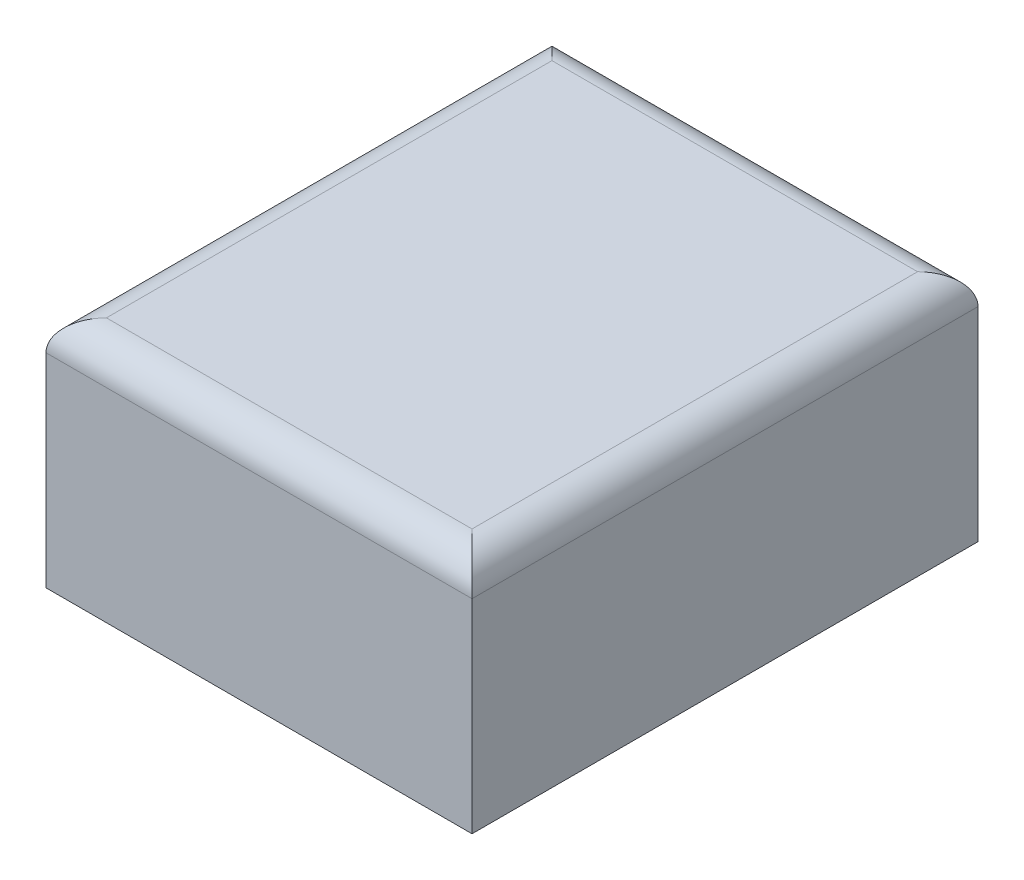
ISO-10303-21;
HEADER;
FILE_DESCRIPTION(('STEP AP214'),'2;1');
FILE_NAME('part.step','',(''),(''),'','','');
FILE_SCHEMA(('AUTOMOTIVE_DESIGN { 1 0 10303 214 1 1 1 1 }'));
ENDSEC;
DATA;
#1=APPLICATION_CONTEXT('core data for automotive mechanical design processes');
#2=APPLICATION_PROTOCOL_DEFINITION('international standard','automotive_design',2000,#1);
#3=PRODUCT_CONTEXT('',#1,'mechanical');
#4=PRODUCT('Part','Part','',(#3));
#5=PRODUCT_RELATED_PRODUCT_CATEGORY('part','',(#4));
#6=PRODUCT_DEFINITION_FORMATION('','',#4);
#7=PRODUCT_DEFINITION_CONTEXT('part definition',#1,'design');
#8=PRODUCT_DEFINITION('design','',#6,#7);
#9=PRODUCT_DEFINITION_SHAPE('','',#8);
#10=(LENGTH_UNIT() NAMED_UNIT(*) SI_UNIT(.MILLI.,.METRE.));
#11=(NAMED_UNIT(*) PLANE_ANGLE_UNIT() SI_UNIT($,.RADIAN.));
#12=(NAMED_UNIT(*) SI_UNIT($,.STERADIAN.) SOLID_ANGLE_UNIT());
#13=UNCERTAINTY_MEASURE_WITH_UNIT(LENGTH_MEASURE(1.E-05),#10,'distance_accuracy_value','');
#14=(GEOMETRIC_REPRESENTATION_CONTEXT(3) GLOBAL_UNCERTAINTY_ASSIGNED_CONTEXT((#13)) GLOBAL_UNIT_ASSIGNED_CONTEXT((#10,
#11,#12)) REPRESENTATION_CONTEXT('',''));
#15=CARTESIAN_POINT('',(0.,0.,0.));
#16=DIRECTION('',(0.,0.,1.));
#17=DIRECTION('',(1.,0.,0.));
#18=AXIS2_PLACEMENT_3D('',#15,#16,#17);
#19=CARTESIAN_POINT('',(-35.259754499997,38.7,-41.8740394999845));
#20=DIRECTION('',(1.,0.,0.));
#21=DIRECTION('',(0.,0.,-1.));
#22=AXIS2_PLACEMENT_3D('',#19,#20,#21);
#23=PLANE('',#22);
#24=DIRECTION('',(0.,-1.,0.));
#25=VECTOR('',#24,1.);
#26=CARTESIAN_POINT('',(-35.259754499997,38.7,41.8740394999845));
#27=LINE('',#26,#25);
#28=CARTESIAN_POINT('',(-35.259754499997,33.7,41.8740394999845));
#29=VERTEX_POINT('',#28);
#30=CARTESIAN_POINT('',(-35.259754499997,0.,41.8740394999845));
#31=VERTEX_POINT('',#30);
#32=EDGE_CURVE('E102',#29,#31,#27,.T.);
#33=ORIENTED_EDGE('',*,*,#32,.F.);
#34=DIRECTION('',(0.,0.,1.));
#35=VECTOR('',#34,1.);
#36=CARTESIAN_POINT('',(-35.259754499997,33.7,-41.8740394999845));
#37=LINE('',#36,#35);
#38=CARTESIAN_POINT('',(-35.259754499997,33.7,-41.8740394999845));
#39=VERTEX_POINT('',#38);
#40=EDGE_CURVE('E59',#29,#39,#37,.F.);
#41=ORIENTED_EDGE('',*,*,#40,.T.);
#42=DIRECTION('',(0.,-1.,0.));
#43=VECTOR('',#42,1.);
#44=CARTESIAN_POINT('',(-35.259754499997,38.7,-41.8740394999845));
#45=LINE('',#44,#43);
#46=CARTESIAN_POINT('',(-35.259754499997,0.,-41.8740394999845));
#47=VERTEX_POINT('',#46);
#48=EDGE_CURVE('E124',#39,#47,#45,.T.);
#49=ORIENTED_EDGE('',*,*,#48,.T.);
#50=DIRECTION('',(0.,0.,1.));
#51=VECTOR('',#50,1.);
#52=CARTESIAN_POINT('',(-35.259754499997,0.,-41.8740394999845));
#53=LINE('',#52,#51);
#54=EDGE_CURVE('E118',#47,#31,#53,.T.);
#55=ORIENTED_EDGE('',*,*,#54,.T.);
#56=EDGE_LOOP('',(#33,#41,#49,#55));
#57=FACE_BOUND('',#56,.T.);
#58=ADVANCED_FACE('F49',(#57),#23,.F.);
#59=CARTESIAN_POINT('',(-35.259754499997,38.7,41.8740394999845));
#60=DIRECTION('',(0.,0.,-1.));
#61=DIRECTION('',(-1.,0.,0.));
#62=AXIS2_PLACEMENT_3D('',#59,#60,#61);
#63=PLANE('',#62);
#64=DIRECTION('',(0.,-1.,0.));
#65=VECTOR('',#64,1.);
#66=CARTESIAN_POINT('',(35.259754499997,38.7,41.8740394999845));
#67=LINE('',#66,#65);
#68=CARTESIAN_POINT('',(35.259754499997,33.7,41.8740394999845));
#69=VERTEX_POINT('',#68);
#70=CARTESIAN_POINT('',(35.259754499997,0.,41.8740394999845));
#71=VERTEX_POINT('',#70);
#72=EDGE_CURVE('E112',#69,#71,#67,.T.);
#73=ORIENTED_EDGE('',*,*,#72,.F.);
#74=DIRECTION('',(1.,0.,0.));
#75=VECTOR('',#74,1.);
#76=CARTESIAN_POINT('',(-35.259754499997,33.7,41.8740394999845));
#77=LINE('',#76,#75);
#78=EDGE_CURVE('E11',#69,#29,#77,.F.);
#79=ORIENTED_EDGE('',*,*,#78,.T.);
#80=ORIENTED_EDGE('',*,*,#32,.T.);
#81=DIRECTION('',(1.,0.,0.));
#82=VECTOR('',#81,1.);
#83=CARTESIAN_POINT('',(-35.259754499997,0.,41.8740394999845));
#84=LINE('',#83,#82);
#85=EDGE_CURVE('E105',#31,#71,#84,.T.);
#86=ORIENTED_EDGE('',*,*,#85,.T.);
#87=EDGE_LOOP('',(#73,#79,#80,#86));
#88=FACE_BOUND('',#87,.T.);
#89=ADVANCED_FACE('F104',(#88),#63,.F.);
#90=CARTESIAN_POINT('',(35.259754499997,38.7,-41.8740394999845));
#91=DIRECTION('',(-1.,0.,0.));
#92=DIRECTION('',(0.,0.,1.));
#93=AXIS2_PLACEMENT_3D('',#90,#91,#92);
#94=PLANE('',#93);
#95=DIRECTION('',(0.,-1.,0.));
#96=VECTOR('',#95,1.);
#97=CARTESIAN_POINT('',(35.259754499997,38.7,-41.8740394999845));
#98=LINE('',#97,#96);
#99=CARTESIAN_POINT('',(35.259754499997,33.7,-41.8740394999845));
#100=VERTEX_POINT('',#99);
#101=CARTESIAN_POINT('',(35.259754499997,0.,-41.8740394999845));
#102=VERTEX_POINT('',#101);
#103=EDGE_CURVE('E141',#100,#102,#98,.T.);
#104=ORIENTED_EDGE('',*,*,#103,.F.);
#105=DIRECTION('',(0.,0.,-1.));
#106=VECTOR('',#105,1.);
#107=CARTESIAN_POINT('',(35.259754499997,33.7,41.8740394999845));
#108=LINE('',#107,#106);
#109=EDGE_CURVE('E73',#100,#69,#108,.F.);
#110=ORIENTED_EDGE('',*,*,#109,.T.);
#111=ORIENTED_EDGE('',*,*,#72,.T.);
#112=DIRECTION('',(0.,0.,-1.));
#113=VECTOR('',#112,1.);
#114=CARTESIAN_POINT('',(35.259754499997,0.,-41.8740394999845));
#115=LINE('',#114,#113);
#116=EDGE_CURVE('E120',#71,#102,#115,.T.);
#117=ORIENTED_EDGE('',*,*,#116,.T.);
#118=EDGE_LOOP('',(#104,#110,#111,#117));
#119=FACE_BOUND('',#118,.T.);
#120=ADVANCED_FACE('F191',(#119),#94,.F.);
#121=CARTESIAN_POINT('',(-35.259754499997,38.7,-41.8740394999845));
#122=DIRECTION('',(0.,0.,1.));
#123=DIRECTION('',(1.,0.,0.));
#124=AXIS2_PLACEMENT_3D('',#121,#122,#123);
#125=PLANE('',#124);
#126=ORIENTED_EDGE('',*,*,#48,.F.);
#127=DIRECTION('',(-1.,0.,0.));
#128=VECTOR('',#127,1.);
#129=CARTESIAN_POINT('',(35.259754499997,33.7,-41.8740394999845));
#130=LINE('',#129,#128);
#131=EDGE_CURVE('E157',#39,#100,#130,.F.);
#132=ORIENTED_EDGE('',*,*,#131,.T.);
#133=ORIENTED_EDGE('',*,*,#103,.T.);
#134=DIRECTION('',(-1.,0.,0.));
#135=VECTOR('',#134,1.);
#136=CARTESIAN_POINT('',(-35.259754499997,0.,-41.8740394999845));
#137=LINE('',#136,#135);
#138=EDGE_CURVE('E136',#102,#47,#137,.T.);
#139=ORIENTED_EDGE('',*,*,#138,.T.);
#140=EDGE_LOOP('',(#126,#132,#133,#139));
#141=FACE_BOUND('',#140,.T.);
#142=ADVANCED_FACE('F190',(#141),#125,.F.);
#143=CARTESIAN_POINT('',(0.,38.7,0.));
#144=DIRECTION('',(0.,1.,0.));
#145=DIRECTION('',(0.,0.,1.));
#146=AXIS2_PLACEMENT_3D('',#143,#144,#145);
#147=PLANE('',#146);
#148=DIRECTION('',(0.,0.,-1.));
#149=VECTOR('',#148,1.);
#150=CARTESIAN_POINT('',(30.259754499997,38.7,-41.8740394999845));
#151=LINE('',#150,#149);
#152=CARTESIAN_POINT('',(30.259754499997,38.7,36.8740394999845));
#153=VERTEX_POINT('',#152);
#154=CARTESIAN_POINT('',(30.259754499997,38.7,-36.8740394999845));
#155=VERTEX_POINT('',#154);
#156=EDGE_CURVE('E150',#153,#155,#151,.T.);
#157=ORIENTED_EDGE('',*,*,#156,.T.);
#158=DIRECTION('',(-1.,0.,0.));
#159=VECTOR('',#158,1.);
#160=CARTESIAN_POINT('',(-35.259754499997,38.7,-36.8740394999845));
#161=LINE('',#160,#159);
#162=CARTESIAN_POINT('',(-30.259754499997,38.7,-36.8740394999845));
#163=VERTEX_POINT('',#162);
#164=EDGE_CURVE('E153',#155,#163,#161,.T.);
#165=ORIENTED_EDGE('',*,*,#164,.T.);
#166=DIRECTION('',(0.,0.,1.));
#167=VECTOR('',#166,1.);
#168=CARTESIAN_POINT('',(-30.259754499997,38.7,41.8740394999845));
#169=LINE('',#168,#167);
#170=CARTESIAN_POINT('',(-30.259754499997,38.7,36.8740394999845));
#171=VERTEX_POINT('',#170);
#172=EDGE_CURVE('E147',#163,#171,#169,.T.);
#173=ORIENTED_EDGE('',*,*,#172,.T.);
#174=DIRECTION('',(1.,0.,0.));
#175=VECTOR('',#174,1.);
#176=CARTESIAN_POINT('',(35.259754499997,38.7,36.8740394999845));
#177=LINE('',#176,#175);
#178=EDGE_CURVE('E111',#171,#153,#177,.T.);
#179=ORIENTED_EDGE('',*,*,#178,.T.);
#180=EDGE_LOOP('',(#157,#165,#173,#179));
#181=FACE_BOUND('',#180,.T.);
#182=ADVANCED_FACE('F183',(#181),#147,.T.);
#183=CARTESIAN_POINT('',(0.,0.,0.));
#184=DIRECTION('',(0.,1.,0.));
#185=DIRECTION('',(0.,0.,1.));
#186=AXIS2_PLACEMENT_3D('',#183,#184,#185);
#187=PLANE('',#186);
#188=ORIENTED_EDGE('',*,*,#54,.F.);
#189=ORIENTED_EDGE('',*,*,#138,.F.);
#190=ORIENTED_EDGE('',*,*,#116,.F.);
#191=ORIENTED_EDGE('',*,*,#85,.F.);
#192=EDGE_LOOP('',(#188,#189,#190,#191));
#193=FACE_BOUND('',#192,.T.);
#194=ADVANCED_FACE('F116',(#193),#187,.F.);
#195=CARTESIAN_POINT('',(0.,33.7,36.8740394999845));
#196=DIRECTION('',(-1.,0.,0.));
#197=DIRECTION('',(0.,0.,1.));
#198=AXIS2_PLACEMENT_3D('',#195,#196,#197);
#199=CYLINDRICAL_SURFACE('',#198,5.);
#200=CARTESIAN_POINT('',(-30.259754499997,33.7,36.8740394999845));
#201=DIRECTION('',(-0.707106781186547,0.,-0.707106781186547));
#202=DIRECTION('',(-0.707106781186547,0.,0.707106781186547));
#203=AXIS2_PLACEMENT_3D('',#200,#201,#202);
#204=ELLIPSE('',#203,7.07106781186547,5.);
#205=EDGE_CURVE('E132',#29,#171,#204,.T.);
#206=ORIENTED_EDGE('',*,*,#205,.F.);
#207=ORIENTED_EDGE('',*,*,#78,.F.);
#208=CARTESIAN_POINT('',(30.259754499997,33.7,36.8740394999845));
#209=DIRECTION('',(-0.707106781186547,0.,0.707106781186547));
#210=DIRECTION('',(-0.707106781186547,0.,-0.707106781186547));
#211=AXIS2_PLACEMENT_3D('',#208,#209,#210);
#212=ELLIPSE('',#211,7.07106781186547,5.);
#213=EDGE_CURVE('E53',#153,#69,#212,.F.);
#214=ORIENTED_EDGE('',*,*,#213,.F.);
#215=ORIENTED_EDGE('',*,*,#178,.F.);
#216=EDGE_LOOP('',(#206,#207,#214,#215));
#217=FACE_BOUND('',#216,.T.);
#218=ADVANCED_FACE('F51',(#217),#199,.T.);
#219=CARTESIAN_POINT('',(30.259754499997,33.7,0.));
#220=DIRECTION('',(0.,0.,1.));
#221=DIRECTION('',(1.,0.,0.));
#222=AXIS2_PLACEMENT_3D('',#219,#220,#221);
#223=CYLINDRICAL_SURFACE('',#222,5.);
#224=ORIENTED_EDGE('',*,*,#213,.T.);
#225=ORIENTED_EDGE('',*,*,#109,.F.);
#226=CARTESIAN_POINT('',(30.259754499997,33.7,-36.8740394999845));
#227=DIRECTION('',(0.707106781186547,0.,0.707106781186547));
#228=DIRECTION('',(-0.707106781186547,0.,0.707106781186547));
#229=AXIS2_PLACEMENT_3D('',#226,#227,#228);
#230=ELLIPSE('',#229,7.07106781186547,5.);
#231=EDGE_CURVE('E168',#155,#100,#230,.F.);
#232=ORIENTED_EDGE('',*,*,#231,.F.);
#233=ORIENTED_EDGE('',*,*,#156,.F.);
#234=EDGE_LOOP('',(#224,#225,#232,#233));
#235=FACE_BOUND('',#234,.T.);
#236=ADVANCED_FACE('F206',(#235),#223,.T.);
#237=CARTESIAN_POINT('',(-30.259754499997,33.7,0.));
#238=DIRECTION('',(0.,0.,-1.));
#239=DIRECTION('',(-1.,0.,0.));
#240=AXIS2_PLACEMENT_3D('',#237,#238,#239);
#241=CYLINDRICAL_SURFACE('',#240,5.);
#242=ORIENTED_EDGE('',*,*,#205,.T.);
#243=ORIENTED_EDGE('',*,*,#172,.F.);
#244=CARTESIAN_POINT('',(-30.259754499997,33.7,-36.8740394999845));
#245=DIRECTION('',(0.707106781186547,0.,-0.707106781186547));
#246=DIRECTION('',(-0.707106781186547,0.,-0.707106781186547));
#247=AXIS2_PLACEMENT_3D('',#244,#245,#246);
#248=ELLIPSE('',#247,7.07106781186547,5.);
#249=EDGE_CURVE('E165',#39,#163,#248,.T.);
#250=ORIENTED_EDGE('',*,*,#249,.F.);
#251=ORIENTED_EDGE('',*,*,#40,.F.);
#252=EDGE_LOOP('',(#242,#243,#250,#251));
#253=FACE_BOUND('',#252,.T.);
#254=ADVANCED_FACE('F176',(#253),#241,.T.);
#255=CARTESIAN_POINT('',(0.,33.7,-36.8740394999845));
#256=DIRECTION('',(1.,0.,0.));
#257=DIRECTION('',(0.,0.,-1.));
#258=AXIS2_PLACEMENT_3D('',#255,#256,#257);
#259=CYLINDRICAL_SURFACE('',#258,5.);
#260=ORIENTED_EDGE('',*,*,#231,.T.);
#261=ORIENTED_EDGE('',*,*,#131,.F.);
#262=ORIENTED_EDGE('',*,*,#249,.T.);
#263=ORIENTED_EDGE('',*,*,#164,.F.);
#264=EDGE_LOOP('',(#260,#261,#262,#263));
#265=FACE_BOUND('',#264,.T.);
#266=ADVANCED_FACE('F187',(#265),#259,.T.);
#267=CLOSED_SHELL('',(#58,#89,#120,#142,#182,#194,#218,#236,#254,#266));
#268=MANIFOLD_SOLID_BREP('B2',#267);
#269=ADVANCED_BREP_SHAPE_REPRESENTATION('',(#18,#268),#14);
#270=SHAPE_DEFINITION_REPRESENTATION(#9,#269);
ENDSEC;
END-ISO-10303-21;
